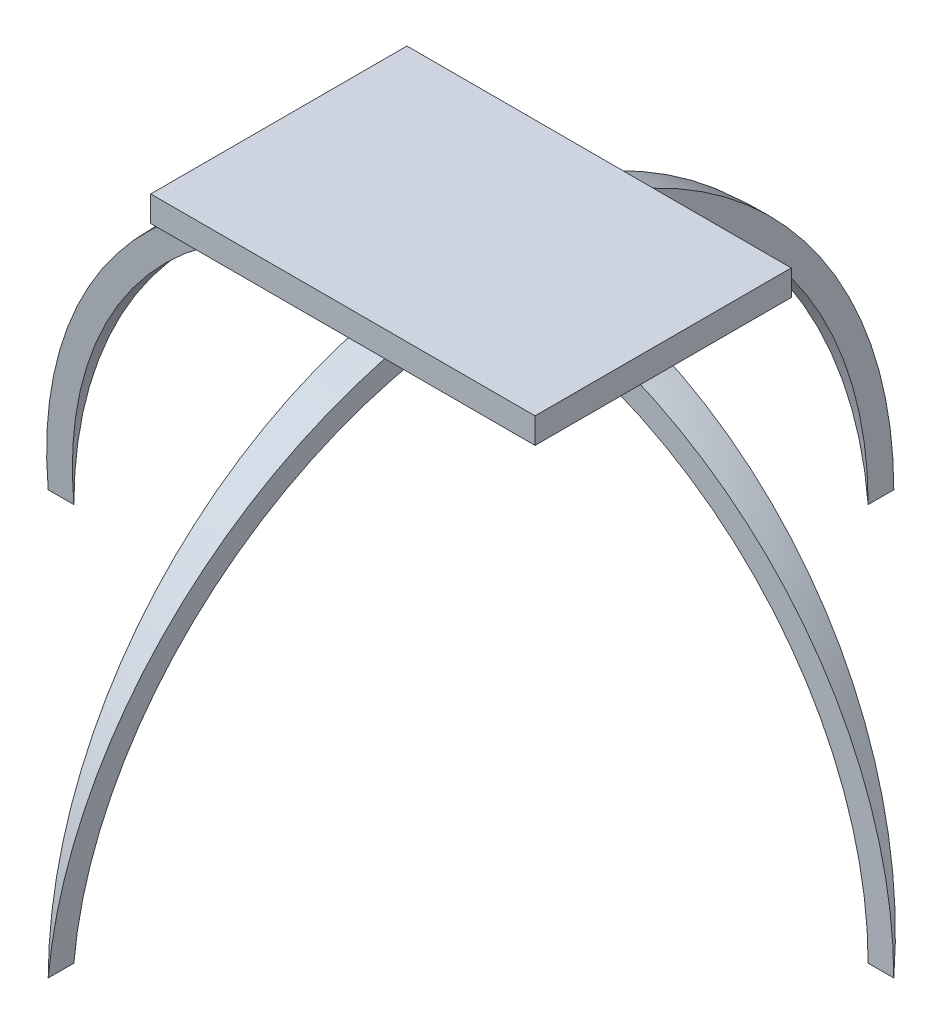
ISO-10303-21;
HEADER;
FILE_DESCRIPTION(('STEP AP214'),'2;1');
FILE_NAME('part.step','',(''),(''),'','','');
FILE_SCHEMA(('AUTOMOTIVE_DESIGN { 1 0 10303 214 1 1 1 1 }'));
ENDSEC;
DATA;
#1=APPLICATION_CONTEXT('core data for automotive mechanical design processes');
#2=APPLICATION_PROTOCOL_DEFINITION('international standard','automotive_design',2000,#1);
#3=PRODUCT_CONTEXT('',#1,'mechanical');
#4=PRODUCT('Part','Part','',(#3));
#5=PRODUCT_RELATED_PRODUCT_CATEGORY('part','',(#4));
#6=PRODUCT_DEFINITION_FORMATION('','',#4);
#7=PRODUCT_DEFINITION_CONTEXT('part definition',#1,'design');
#8=PRODUCT_DEFINITION('design','',#6,#7);
#9=PRODUCT_DEFINITION_SHAPE('','',#8);
#10=(LENGTH_UNIT() NAMED_UNIT(*) SI_UNIT(.MILLI.,.METRE.));
#11=(NAMED_UNIT(*) PLANE_ANGLE_UNIT() SI_UNIT($,.RADIAN.));
#12=(NAMED_UNIT(*) SI_UNIT($,.STERADIAN.) SOLID_ANGLE_UNIT());
#13=UNCERTAINTY_MEASURE_WITH_UNIT(LENGTH_MEASURE(1.E-05),#10,'distance_accuracy_value','');
#14=(GEOMETRIC_REPRESENTATION_CONTEXT(3) GLOBAL_UNCERTAINTY_ASSIGNED_CONTEXT((#13)) GLOBAL_UNIT_ASSIGNED_CONTEXT((#10,
#11,#12)) REPRESENTATION_CONTEXT('',''));
#15=CARTESIAN_POINT('',(0.,0.,0.));
#16=DIRECTION('',(0.,0.,1.));
#17=DIRECTION('',(1.,0.,0.));
#18=AXIS2_PLACEMENT_3D('',#15,#16,#17);
#19=CARTESIAN_POINT('',(0.,164.372125185138,14.3806975533637));
#20=DIRECTION('',(-1.,0.,0.));
#21=DIRECTION('',(0.,-1.,0.));
#22=AXIS2_PLACEMENT_3D('',#19,#20,#21);
#23=PLANE('',#22);
#24=DIRECTION('',(0.,0.,-1.));
#25=VECTOR('',#24,1.);
#26=CARTESIAN_POINT('',(0.,160.,14.3806975533637));
#27=LINE('',#26,#25);
#28=CARTESIAN_POINT('',(0.,160.,-13.9981861641479));
#29=VERTEX_POINT('',#28);
#30=CARTESIAN_POINT('',(1.40746112385639E-13,160.,-40.3112887414928));
#31=VERTEX_POINT('',#30);
#32=EDGE_CURVE('E237',#29,#31,#27,.T.);
#33=ORIENTED_EDGE('',*,*,#32,.F.);
#34=DIRECTION('',(0.,0.996194698091746,-0.0871557427476584));
#35=VECTOR('',#34,1.);
#36=CARTESIAN_POINT('',(0.,164.372125185138,-14.3806975533637));
#37=LINE('',#36,#35);
#38=CARTESIAN_POINT('',(0.,154.410178204221,-13.5091401258871));
#39=VERTEX_POINT('',#38);
#40=EDGE_CURVE('E60',#39,#29,#37,.T.);
#41=ORIENTED_EDGE('',*,*,#40,.F.);
#42=CARTESIAN_POINT('',(-3.05311331771918E-13,-3.13203418881935E-13,0.));
#43=DIRECTION('',(-1.,0.,0.));
#44=DIRECTION('',(0.,-1.,0.));
#45=AXIS2_PLACEMENT_3D('',#42,#43,#44);
#46=CIRCLE('',#45,155.);
#47=CARTESIAN_POINT('',(5.41179607520686E-13,0.,-155.));
#48=VERTEX_POINT('',#47);
#49=EDGE_CURVE('E258',#39,#48,#46,.T.);
#50=ORIENTED_EDGE('',*,*,#49,.T.);
#51=DIRECTION('',(0.,0.,1.));
#52=VECTOR('',#51,1.);
#53=CARTESIAN_POINT('',(5.76094420909117E-13,0.,-165.));
#54=LINE('',#53,#52);
#55=CARTESIAN_POINT('',(5.76094420909117E-13,0.,-165.));
#56=VERTEX_POINT('',#55);
#57=EDGE_CURVE('E201',#56,#48,#54,.T.);
#58=ORIENTED_EDGE('',*,*,#57,.F.);
#59=CARTESIAN_POINT('',(0.,0.,0.));
#60=DIRECTION('',(-1.,0.,0.));
#61=DIRECTION('',(0.,0.,1.));
#62=AXIS2_PLACEMENT_3D('',#59,#60,#61);
#63=CIRCLE('',#62,165.);
#64=EDGE_CURVE('E190',#31,#56,#63,.T.);
#65=ORIENTED_EDGE('',*,*,#64,.F.);
#66=EDGE_LOOP('',(#33,#41,#50,#58,#65));
#67=FACE_BOUND('',#66,.T.);
#68=ADVANCED_FACE('F38',(#67),#23,.F.);
#69=CARTESIAN_POINT('',(0.,0.,0.));
#70=DIRECTION('',(-1.,0.,0.));
#71=DIRECTION('',(0.,0.996194698091746,0.0871557427476584));
#72=AXIS2_PLACEMENT_3D('',#69,#70,#71);
#73=SPHERICAL_SURFACE('',#72,165.);
#74=CARTESIAN_POINT('',(0.,160.,0.));
#75=DIRECTION('',(0.,1.,0.));
#76=DIRECTION('',(0.,0.,1.));
#77=AXIS2_PLACEMENT_3D('',#74,#75,#76);
#78=CIRCLE('',#77,40.3112887414928);
#79=CARTESIAN_POINT('',(-40.3112887414928,160.,0.));
#80=VERTEX_POINT('',#79);
#81=CARTESIAN_POINT('',(-37.8027880468341,160.,13.9981861641479));
#82=VERTEX_POINT('',#81);
#83=EDGE_CURVE('E234',#80,#82,#78,.T.);
#84=ORIENTED_EDGE('',*,*,#83,.F.);
#85=CARTESIAN_POINT('',(0.,0.,0.));
#86=DIRECTION('',(0.,0.,1.));
#87=DIRECTION('',(1.,0.,0.));
#88=AXIS2_PLACEMENT_3D('',#85,#86,#87);
#89=CIRCLE('',#88,165.);
#90=CARTESIAN_POINT('',(-165.,0.,0.));
#91=VERTEX_POINT('',#90);
#92=EDGE_CURVE('E244',#80,#91,#89,.T.);
#93=ORIENTED_EDGE('',*,*,#92,.T.);
#94=CARTESIAN_POINT('',(0.,0.,0.));
#95=DIRECTION('',(0.,-0.0871557427476584,0.996194698091746));
#96=DIRECTION('',(1.,0.,0.));
#97=AXIS2_PLACEMENT_3D('',#94,#95,#96);
#98=CIRCLE('',#97,165.);
#99=EDGE_CURVE('E253',#82,#91,#98,.T.);
#100=ORIENTED_EDGE('',*,*,#99,.F.);
#101=EDGE_LOOP('',(#84,#93,#100));
#102=FACE_BOUND('',#101,.T.);
#103=ADVANCED_FACE('F300',(#102),#73,.T.);
#104=CARTESIAN_POINT('',(0.,0.,0.));
#105=DIRECTION('',(0.,-0.0871557427476584,0.996194698091746));
#106=DIRECTION('',(1.,0.,0.));
#107=AXIS2_PLACEMENT_3D('',#104,#105,#106);
#108=PLANE('',#107);
#109=DIRECTION('',(0.,0.996194698091746,0.0871557427476584));
#110=VECTOR('',#109,1.);
#111=CARTESIAN_POINT('',(0.,164.372125185138,14.3806975533637));
#112=LINE('',#111,#110);
#113=CARTESIAN_POINT('',(-1.41500731960055E-13,154.410178204221,13.5091401258871));
#114=VERTEX_POINT('',#113);
#115=CARTESIAN_POINT('',(-1.46623217309324E-13,160.,13.9981861641479));
#116=VERTEX_POINT('',#115);
#117=EDGE_CURVE('E250',#114,#116,#112,.T.);
#118=ORIENTED_EDGE('',*,*,#117,.T.);
#119=DIRECTION('',(-1.,0.,0.));
#120=VECTOR('',#119,1.);
#121=CARTESIAN_POINT('',(0.,160.,13.9981861641479));
#122=LINE('',#121,#120);
#123=EDGE_CURVE('E239',#116,#82,#122,.T.);
#124=ORIENTED_EDGE('',*,*,#123,.T.);
#125=ORIENTED_EDGE('',*,*,#99,.T.);
#126=DIRECTION('',(1.,0.,0.));
#127=VECTOR('',#126,1.);
#128=CARTESIAN_POINT('',(-165.,0.,0.));
#129=LINE('',#128,#127);
#130=CARTESIAN_POINT('',(-155.,0.,0.));
#131=VERTEX_POINT('',#130);
#132=EDGE_CURVE('E255',#91,#131,#129,.T.);
#133=ORIENTED_EDGE('',*,*,#132,.T.);
#134=CARTESIAN_POINT('',(0.,0.,0.));
#135=DIRECTION('',(0.,0.0871557427476584,-0.996194698091746));
#136=DIRECTION('',(1.,0.,0.));
#137=AXIS2_PLACEMENT_3D('',#134,#135,#136);
#138=CIRCLE('',#137,155.);
#139=EDGE_CURVE('E247',#131,#114,#138,.T.);
#140=ORIENTED_EDGE('',*,*,#139,.T.);
#141=EDGE_LOOP('',(#118,#124,#125,#133,#140));
#142=FACE_BOUND('',#141,.T.);
#143=ADVANCED_FACE('F303',(#142),#108,.T.);
#144=CARTESIAN_POINT('',(0.,0.,0.));
#145=DIRECTION('',(0.,0.,1.));
#146=DIRECTION('',(1.,0.,0.));
#147=AXIS2_PLACEMENT_3D('',#144,#145,#146);
#148=PLANE('',#147);
#149=DIRECTION('',(-1.,0.,0.));
#150=VECTOR('',#149,1.);
#151=CARTESIAN_POINT('',(0.,160.,0.));
#152=LINE('',#151,#150);
#153=CARTESIAN_POINT('',(-13.9981861641478,160.,0.));
#154=VERTEX_POINT('',#153);
#155=EDGE_CURVE('E260',#154,#80,#152,.T.);
#156=ORIENTED_EDGE('',*,*,#155,.F.);
#157=DIRECTION('',(-0.0871557427476584,0.996194698091746,0.));
#158=VECTOR('',#157,1.);
#159=CARTESIAN_POINT('',(-14.3806975533637,164.372125185138,0.));
#160=LINE('',#159,#158);
#161=CARTESIAN_POINT('',(-13.5091401258871,154.410178204221,0.));
#162=VERTEX_POINT('',#161);
#163=EDGE_CURVE('E196',#162,#154,#160,.T.);
#164=ORIENTED_EDGE('',*,*,#163,.F.);
#165=CARTESIAN_POINT('',(0.,0.,0.));
#166=DIRECTION('',(0.,0.,-1.));
#167=DIRECTION('',(1.,0.,0.));
#168=AXIS2_PLACEMENT_3D('',#165,#166,#167);
#169=CIRCLE('',#168,155.);
#170=EDGE_CURVE('E241',#131,#162,#169,.T.);
#171=ORIENTED_EDGE('',*,*,#170,.F.);
#172=ORIENTED_EDGE('',*,*,#132,.F.);
#173=ORIENTED_EDGE('',*,*,#92,.F.);
#174=EDGE_LOOP('',(#156,#164,#171,#172,#173));
#175=FACE_BOUND('',#174,.T.);
#176=ADVANCED_FACE('F295',(#175),#148,.F.);
#177=CARTESIAN_POINT('',(0.,0.,0.));
#178=DIRECTION('',(-1.,0.,0.));
#179=DIRECTION('',(0.,-0.996194698091746,-0.0871557427476584));
#180=AXIS2_PLACEMENT_3D('',#177,#178,#179);
#181=SPHERICAL_SURFACE('',#180,155.);
#182=CARTESIAN_POINT('',(0.,0.,0.));
#183=DIRECTION('',(-1.,0.,0.));
#184=DIRECTION('',(0.,0.,-1.));
#185=AXIS2_PLACEMENT_3D('',#182,#183,#184);
#186=CIRCLE('',#185,155.);
#187=CARTESIAN_POINT('',(-1.62353882256206E-12,0.,155.));
#188=VERTEX_POINT('',#187);
#189=EDGE_CURVE('E165',#188,#114,#186,.T.);
#190=ORIENTED_EDGE('',*,*,#189,.T.);
#191=ORIENTED_EDGE('',*,*,#139,.F.);
#192=ORIENTED_EDGE('',*,*,#170,.T.);
#193=CARTESIAN_POINT('',(0.,0.,0.));
#194=DIRECTION('',(0.996194698091746,0.0871557427476584,0.));
#195=DIRECTION('',(0.,0.,1.));
#196=AXIS2_PLACEMENT_3D('',#193,#194,#195);
#197=CIRCLE('',#196,155.);
#198=EDGE_CURVE('E193',#48,#162,#197,.T.);
#199=ORIENTED_EDGE('',*,*,#198,.F.);
#200=ORIENTED_EDGE('',*,*,#49,.F.);
#201=CARTESIAN_POINT('',(0.,0.,0.));
#202=DIRECTION('',(0.,0.0871557427476584,0.996194698091746));
#203=DIRECTION('',(-1.,0.,0.));
#204=AXIS2_PLACEMENT_3D('',#201,#202,#203);
#205=CIRCLE('',#204,155.);
#206=CARTESIAN_POINT('',(155.,0.,0.));
#207=VERTEX_POINT('',#206);
#208=EDGE_CURVE('E181',#207,#39,#205,.T.);
#209=ORIENTED_EDGE('',*,*,#208,.F.);
#210=CARTESIAN_POINT('',(0.,0.,0.));
#211=DIRECTION('',(0.,0.,1.));
#212=DIRECTION('',(-1.,0.,0.));
#213=AXIS2_PLACEMENT_3D('',#210,#211,#212);
#214=CIRCLE('',#213,155.);
#215=CARTESIAN_POINT('',(13.5091401258871,154.410178204221,0.));
#216=VERTEX_POINT('',#215);
#217=EDGE_CURVE('E175',#207,#216,#214,.T.);
#218=ORIENTED_EDGE('',*,*,#217,.T.);
#219=CARTESIAN_POINT('',(0.,0.,0.));
#220=DIRECTION('',(-0.996194698091746,0.0871557427476584,0.));
#221=DIRECTION('',(0.,0.,-1.));
#222=AXIS2_PLACEMENT_3D('',#219,#220,#221);
#223=CIRCLE('',#222,155.);
#224=EDGE_CURVE('E52',#188,#216,#223,.T.);
#225=ORIENTED_EDGE('',*,*,#224,.F.);
#226=EDGE_LOOP('',(#190,#191,#192,#199,#200,#209,#218,#225));
#227=FACE_BOUND('',#226,.T.);
#228=ADVANCED_FACE('F284',(#227),#181,.F.);
#229=CARTESIAN_POINT('',(75.,170.,-50.));
#230=DIRECTION('',(-1.,0.,0.));
#231=DIRECTION('',(0.,0.,1.));
#232=AXIS2_PLACEMENT_3D('',#229,#230,#231);
#233=PLANE('',#232);
#234=DIRECTION('',(0.,0.,-1.));
#235=VECTOR('',#234,1.);
#236=CARTESIAN_POINT('',(75.,160.,-50.));
#237=LINE('',#236,#235);
#238=CARTESIAN_POINT('',(75.,160.,50.));
#239=VERTEX_POINT('',#238);
#240=CARTESIAN_POINT('',(75.,160.,-50.));
#241=VERTEX_POINT('',#240);
#242=EDGE_CURVE('E204',#239,#241,#237,.T.);
#243=ORIENTED_EDGE('',*,*,#242,.T.);
#244=DIRECTION('',(0.,-1.,0.));
#245=VECTOR('',#244,1.);
#246=CARTESIAN_POINT('',(75.,170.,-50.));
#247=LINE('',#246,#245);
#248=CARTESIAN_POINT('',(75.,170.,-50.));
#249=VERTEX_POINT('',#248);
#250=EDGE_CURVE('E231',#249,#241,#247,.T.);
#251=ORIENTED_EDGE('',*,*,#250,.F.);
#252=DIRECTION('',(0.,0.,-1.));
#253=VECTOR('',#252,1.);
#254=CARTESIAN_POINT('',(75.,170.,-50.));
#255=LINE('',#254,#253);
#256=CARTESIAN_POINT('',(75.,170.,50.));
#257=VERTEX_POINT('',#256);
#258=EDGE_CURVE('E205',#257,#249,#255,.T.);
#259=ORIENTED_EDGE('',*,*,#258,.F.);
#260=DIRECTION('',(0.,-1.,0.));
#261=VECTOR('',#260,1.);
#262=CARTESIAN_POINT('',(75.,170.,50.));
#263=LINE('',#262,#261);
#264=EDGE_CURVE('E215',#257,#239,#263,.T.);
#265=ORIENTED_EDGE('',*,*,#264,.T.);
#266=EDGE_LOOP('',(#243,#251,#259,#265));
#267=FACE_BOUND('',#266,.T.);
#268=ADVANCED_FACE('F330',(#267),#233,.F.);
#269=CARTESIAN_POINT('',(-75.,170.,-50.));
#270=DIRECTION('',(0.,0.,1.));
#271=DIRECTION('',(1.,0.,0.));
#272=AXIS2_PLACEMENT_3D('',#269,#270,#271);
#273=PLANE('',#272);
#274=DIRECTION('',(-1.,0.,0.));
#275=VECTOR('',#274,1.);
#276=CARTESIAN_POINT('',(-75.,160.,-50.));
#277=LINE('',#276,#275);
#278=CARTESIAN_POINT('',(-75.,160.,-50.));
#279=VERTEX_POINT('',#278);
#280=EDGE_CURVE('E218',#241,#279,#277,.T.);
#281=ORIENTED_EDGE('',*,*,#280,.T.);
#282=DIRECTION('',(0.,-1.,0.));
#283=VECTOR('',#282,1.);
#284=CARTESIAN_POINT('',(-75.,170.,-50.));
#285=LINE('',#284,#283);
#286=CARTESIAN_POINT('',(-75.,170.,-50.));
#287=VERTEX_POINT('',#286);
#288=EDGE_CURVE('E228',#287,#279,#285,.T.);
#289=ORIENTED_EDGE('',*,*,#288,.F.);
#290=DIRECTION('',(-1.,0.,0.));
#291=VECTOR('',#290,1.);
#292=CARTESIAN_POINT('',(-75.,170.,-50.));
#293=LINE('',#292,#291);
#294=EDGE_CURVE('E208',#249,#287,#293,.T.);
#295=ORIENTED_EDGE('',*,*,#294,.F.);
#296=ORIENTED_EDGE('',*,*,#250,.T.);
#297=EDGE_LOOP('',(#281,#289,#295,#296));
#298=FACE_BOUND('',#297,.T.);
#299=ADVANCED_FACE('F336',(#298),#273,.F.);
#300=CARTESIAN_POINT('',(-75.,170.,-50.));
#301=DIRECTION('',(1.,0.,0.));
#302=DIRECTION('',(0.,0.,-1.));
#303=AXIS2_PLACEMENT_3D('',#300,#301,#302);
#304=PLANE('',#303);
#305=DIRECTION('',(0.,0.,1.));
#306=VECTOR('',#305,1.);
#307=CARTESIAN_POINT('',(-75.,160.,-50.));
#308=LINE('',#307,#306);
#309=CARTESIAN_POINT('',(-75.,160.,50.));
#310=VERTEX_POINT('',#309);
#311=EDGE_CURVE('E220',#279,#310,#308,.T.);
#312=ORIENTED_EDGE('',*,*,#311,.T.);
#313=DIRECTION('',(0.,-1.,0.));
#314=VECTOR('',#313,1.);
#315=CARTESIAN_POINT('',(-75.,170.,50.));
#316=LINE('',#315,#314);
#317=CARTESIAN_POINT('',(-75.,170.,50.));
#318=VERTEX_POINT('',#317);
#319=EDGE_CURVE('E225',#318,#310,#316,.T.);
#320=ORIENTED_EDGE('',*,*,#319,.F.);
#321=DIRECTION('',(0.,0.,1.));
#322=VECTOR('',#321,1.);
#323=CARTESIAN_POINT('',(-75.,170.,-50.));
#324=LINE('',#323,#322);
#325=EDGE_CURVE('E211',#287,#318,#324,.T.);
#326=ORIENTED_EDGE('',*,*,#325,.F.);
#327=ORIENTED_EDGE('',*,*,#288,.T.);
#328=EDGE_LOOP('',(#312,#320,#326,#327));
#329=FACE_BOUND('',#328,.T.);
#330=ADVANCED_FACE('F340',(#329),#304,.F.);
#331=CARTESIAN_POINT('',(-75.,170.,50.));
#332=DIRECTION('',(0.,0.,-1.));
#333=DIRECTION('',(-1.,0.,0.));
#334=AXIS2_PLACEMENT_3D('',#331,#332,#333);
#335=PLANE('',#334);
#336=DIRECTION('',(1.,0.,0.));
#337=VECTOR('',#336,1.);
#338=CARTESIAN_POINT('',(-75.,160.,50.));
#339=LINE('',#338,#337);
#340=EDGE_CURVE('E209',#310,#239,#339,.T.);
#341=ORIENTED_EDGE('',*,*,#340,.T.);
#342=ORIENTED_EDGE('',*,*,#264,.F.);
#343=DIRECTION('',(1.,0.,0.));
#344=VECTOR('',#343,1.);
#345=CARTESIAN_POINT('',(-75.,170.,50.));
#346=LINE('',#345,#344);
#347=EDGE_CURVE('E213',#318,#257,#346,.T.);
#348=ORIENTED_EDGE('',*,*,#347,.F.);
#349=ORIENTED_EDGE('',*,*,#319,.T.);
#350=EDGE_LOOP('',(#341,#342,#348,#349));
#351=FACE_BOUND('',#350,.T.);
#352=ADVANCED_FACE('F344',(#351),#335,.F.);
#353=CARTESIAN_POINT('',(0.,170.,0.));
#354=DIRECTION('',(0.,1.,0.));
#355=DIRECTION('',(0.,0.,1.));
#356=AXIS2_PLACEMENT_3D('',#353,#354,#355);
#357=PLANE('',#356);
#358=ORIENTED_EDGE('',*,*,#258,.T.);
#359=ORIENTED_EDGE('',*,*,#294,.T.);
#360=ORIENTED_EDGE('',*,*,#325,.T.);
#361=ORIENTED_EDGE('',*,*,#347,.T.);
#362=EDGE_LOOP('',(#358,#359,#360,#361));
#363=FACE_BOUND('',#362,.T.);
#364=ADVANCED_FACE('F348',(#363),#357,.T.);
#365=CARTESIAN_POINT('',(0.,160.,0.));
#366=DIRECTION('',(0.,1.,0.));
#367=DIRECTION('',(0.,0.,1.));
#368=AXIS2_PLACEMENT_3D('',#365,#366,#367);
#369=PLANE('',#368);
#370=CARTESIAN_POINT('',(0.,160.,0.));
#371=DIRECTION('',(0.,1.,0.));
#372=DIRECTION('',(0.,0.,1.));
#373=AXIS2_PLACEMENT_3D('',#370,#371,#372);
#374=CIRCLE('',#373,40.3112887414928);
#375=CARTESIAN_POINT('',(13.9981861641475,160.,37.8027880468342));
#376=VERTEX_POINT('',#375);
#377=CARTESIAN_POINT('',(-4.22238337156918E-13,160.,40.3112887414928));
#378=VERTEX_POINT('',#377);
#379=EDGE_CURVE('E11',#376,#378,#374,.F.);
#380=ORIENTED_EDGE('',*,*,#379,.F.);
#381=DIRECTION('',(0.,0.,-1.));
#382=VECTOR('',#381,1.);
#383=CARTESIAN_POINT('',(13.9981861641479,160.,1.49097893290887E-13));
#384=LINE('',#383,#382);
#385=CARTESIAN_POINT('',(13.9981861641479,160.,1.42189038903176E-13));
#386=VERTEX_POINT('',#385);
#387=EDGE_CURVE('E155',#376,#386,#384,.T.);
#388=ORIENTED_EDGE('',*,*,#387,.T.);
#389=DIRECTION('',(-1.,0.,0.));
#390=VECTOR('',#389,1.);
#391=CARTESIAN_POINT('',(0.,160.,0.));
#392=LINE('',#391,#390);
#393=CARTESIAN_POINT('',(40.3112887414928,160.,0.));
#394=VERTEX_POINT('',#393);
#395=EDGE_CURVE('E267',#394,#386,#392,.T.);
#396=ORIENTED_EDGE('',*,*,#395,.F.);
#397=CARTESIAN_POINT('',(0.,160.,0.));
#398=DIRECTION('',(0.,1.,0.));
#399=DIRECTION('',(0.,0.,1.));
#400=AXIS2_PLACEMENT_3D('',#397,#398,#399);
#401=CIRCLE('',#400,40.3112887414928);
#402=CARTESIAN_POINT('',(37.8027880468341,160.,-13.9981861641479));
#403=VERTEX_POINT('',#402);
#404=EDGE_CURVE('E270',#403,#394,#401,.F.);
#405=ORIENTED_EDGE('',*,*,#404,.F.);
#406=DIRECTION('',(-1.,0.,0.));
#407=VECTOR('',#406,1.);
#408=CARTESIAN_POINT('',(0.,160.,-13.9981861641479));
#409=LINE('',#408,#407);
#410=EDGE_CURVE('E45',#403,#29,#409,.T.);
#411=ORIENTED_EDGE('',*,*,#410,.T.);
#412=ORIENTED_EDGE('',*,*,#32,.T.);
#413=CARTESIAN_POINT('',(0.,160.,0.));
#414=DIRECTION('',(0.,1.,0.));
#415=DIRECTION('',(0.,0.,1.));
#416=AXIS2_PLACEMENT_3D('',#413,#414,#415);
#417=CIRCLE('',#416,40.3112887414928);
#418=CARTESIAN_POINT('',(-13.9981861641478,160.,-37.8027880468341));
#419=VERTEX_POINT('',#418);
#420=EDGE_CURVE('E262',#419,#31,#417,.F.);
#421=ORIENTED_EDGE('',*,*,#420,.F.);
#422=DIRECTION('',(0.,0.,1.));
#423=VECTOR('',#422,1.);
#424=CARTESIAN_POINT('',(-13.9981861641479,160.,0.));
#425=LINE('',#424,#423);
#426=EDGE_CURVE('E265',#419,#154,#425,.T.);
#427=ORIENTED_EDGE('',*,*,#426,.T.);
#428=ORIENTED_EDGE('',*,*,#155,.T.);
#429=ORIENTED_EDGE('',*,*,#83,.T.);
#430=ORIENTED_EDGE('',*,*,#123,.F.);
#431=DIRECTION('',(0.,0.,-1.));
#432=VECTOR('',#431,1.);
#433=CARTESIAN_POINT('',(0.,160.,0.));
#434=LINE('',#433,#432);
#435=EDGE_CURVE('E169',#378,#116,#434,.T.);
#436=ORIENTED_EDGE('',*,*,#435,.F.);
#437=EDGE_LOOP('',(#380,#388,#396,#405,#411,#412,#421,#427,#428,#429,#430,#436));
#438=FACE_BOUND('',#437,.T.);
#439=ORIENTED_EDGE('',*,*,#242,.F.);
#440=ORIENTED_EDGE('',*,*,#340,.F.);
#441=ORIENTED_EDGE('',*,*,#311,.F.);
#442=ORIENTED_EDGE('',*,*,#280,.F.);
#443=EDGE_LOOP('',(#439,#440,#441,#442));
#444=FACE_BOUND('',#443,.T.);
#445=ADVANCED_FACE('F274',(#438,#444),#369,.F.);
#446=CARTESIAN_POINT('',(0.,0.,0.));
#447=DIRECTION('',(0.,0.,-1.));
#448=DIRECTION('',(-0.0871557427476584,0.996194698091746,0.));
#449=AXIS2_PLACEMENT_3D('',#446,#447,#448);
#450=SPHERICAL_SURFACE('',#449,165.);
#451=CARTESIAN_POINT('',(0.,0.,0.));
#452=DIRECTION('',(-0.996194698091746,-0.0871557427476584,0.));
#453=DIRECTION('',(0.,0.,1.));
#454=AXIS2_PLACEMENT_3D('',#451,#452,#453);
#455=CIRCLE('',#454,165.);
#456=EDGE_CURVE('E199',#419,#56,#455,.T.);
#457=ORIENTED_EDGE('',*,*,#456,.F.);
#458=ORIENTED_EDGE('',*,*,#420,.T.);
#459=ORIENTED_EDGE('',*,*,#64,.T.);
#460=EDGE_LOOP('',(#457,#458,#459));
#461=FACE_BOUND('',#460,.T.);
#462=ADVANCED_FACE('F291',(#461),#450,.T.);
#463=CARTESIAN_POINT('',(0.,0.,0.));
#464=DIRECTION('',(-0.996194698091746,-0.0871557427476584,0.));
#465=DIRECTION('',(0.,0.,1.));
#466=AXIS2_PLACEMENT_3D('',#463,#464,#465);
#467=PLANE('',#466);
#468=ORIENTED_EDGE('',*,*,#426,.F.);
#469=ORIENTED_EDGE('',*,*,#456,.T.);
#470=ORIENTED_EDGE('',*,*,#57,.T.);
#471=ORIENTED_EDGE('',*,*,#198,.T.);
#472=ORIENTED_EDGE('',*,*,#163,.T.);
#473=EDGE_LOOP('',(#468,#469,#470,#471,#472));
#474=FACE_BOUND('',#473,.T.);
#475=ADVANCED_FACE('F288',(#474),#467,.T.);
#476=CARTESIAN_POINT('',(0.,0.,0.));
#477=DIRECTION('',(1.,0.,0.));
#478=DIRECTION('',(0.,0.996194698091746,-0.0871557427476584));
#479=AXIS2_PLACEMENT_3D('',#476,#477,#478);
#480=SPHERICAL_SURFACE('',#479,165.);
#481=CARTESIAN_POINT('',(0.,0.,0.));
#482=DIRECTION('',(0.,-0.0871557427476584,-0.996194698091746));
#483=DIRECTION('',(-1.,0.,0.));
#484=AXIS2_PLACEMENT_3D('',#481,#482,#483);
#485=CIRCLE('',#484,165.);
#486=CARTESIAN_POINT('',(165.,0.,0.));
#487=VERTEX_POINT('',#486);
#488=EDGE_CURVE('E185',#403,#487,#485,.T.);
#489=ORIENTED_EDGE('',*,*,#488,.F.);
#490=ORIENTED_EDGE('',*,*,#404,.T.);
#491=CARTESIAN_POINT('',(0.,0.,0.));
#492=DIRECTION('',(0.,0.,-1.));
#493=DIRECTION('',(-1.,0.,0.));
#494=AXIS2_PLACEMENT_3D('',#491,#492,#493);
#495=CIRCLE('',#494,165.);
#496=EDGE_CURVE('E178',#394,#487,#495,.T.);
#497=ORIENTED_EDGE('',*,*,#496,.T.);
#498=EDGE_LOOP('',(#489,#490,#497));
#499=FACE_BOUND('',#498,.T.);
#500=ADVANCED_FACE('F311',(#499),#480,.T.);
#501=CARTESIAN_POINT('',(0.,0.,0.));
#502=DIRECTION('',(0.,-0.0871557427476584,-0.996194698091746));
#503=DIRECTION('',(-1.,0.,0.));
#504=AXIS2_PLACEMENT_3D('',#501,#502,#503);
#505=PLANE('',#504);
#506=ORIENTED_EDGE('',*,*,#410,.F.);
#507=ORIENTED_EDGE('',*,*,#488,.T.);
#508=DIRECTION('',(-1.,0.,0.));
#509=VECTOR('',#508,1.);
#510=CARTESIAN_POINT('',(165.,0.,0.));
#511=LINE('',#510,#509);
#512=EDGE_CURVE('E187',#487,#207,#511,.T.);
#513=ORIENTED_EDGE('',*,*,#512,.T.);
#514=ORIENTED_EDGE('',*,*,#208,.T.);
#515=ORIENTED_EDGE('',*,*,#40,.T.);
#516=EDGE_LOOP('',(#506,#507,#513,#514,#515));
#517=FACE_BOUND('',#516,.T.);
#518=ADVANCED_FACE('F280',(#517),#505,.T.);
#519=CARTESIAN_POINT('',(0.,0.,0.));
#520=DIRECTION('',(0.,0.,-1.));
#521=DIRECTION('',(-1.,0.,0.));
#522=AXIS2_PLACEMENT_3D('',#519,#520,#521);
#523=PLANE('',#522);
#524=ORIENTED_EDGE('',*,*,#395,.T.);
#525=DIRECTION('',(0.0871557427476584,0.996194698091746,0.));
#526=VECTOR('',#525,1.);
#527=CARTESIAN_POINT('',(14.3806975533637,164.372125185138,1.41795201404155E-13));
#528=LINE('',#527,#526);
#529=EDGE_CURVE('E158',#216,#386,#528,.T.);
#530=ORIENTED_EDGE('',*,*,#529,.F.);
#531=ORIENTED_EDGE('',*,*,#217,.F.);
#532=ORIENTED_EDGE('',*,*,#512,.F.);
#533=ORIENTED_EDGE('',*,*,#496,.F.);
#534=EDGE_LOOP('',(#524,#530,#531,#532,#533));
#535=FACE_BOUND('',#534,.T.);
#536=ADVANCED_FACE('F309',(#535),#523,.F.);
#537=CARTESIAN_POINT('',(0.,0.,0.));
#538=DIRECTION('',(0.,0.,1.));
#539=DIRECTION('',(0.0871557427476584,0.996194698091746,0.));
#540=AXIS2_PLACEMENT_3D('',#537,#538,#539);
#541=SPHERICAL_SURFACE('',#540,165.);
#542=CARTESIAN_POINT('',(0.,0.,0.));
#543=DIRECTION('',(0.996194698091746,-0.0871557427476584,0.));
#544=DIRECTION('',(0.,0.,-1.));
#545=AXIS2_PLACEMENT_3D('',#542,#543,#544);
#546=CIRCLE('',#545,165.);
#547=CARTESIAN_POINT('',(-1.72828326272735E-12,0.,165.));
#548=VERTEX_POINT('',#547);
#549=EDGE_CURVE('E149',#376,#548,#546,.T.);
#550=ORIENTED_EDGE('',*,*,#549,.F.);
#551=ORIENTED_EDGE('',*,*,#379,.T.);
#552=CARTESIAN_POINT('',(0.,0.,0.));
#553=DIRECTION('',(1.,0.,0.));
#554=DIRECTION('',(0.,0.,-1.));
#555=AXIS2_PLACEMENT_3D('',#552,#553,#554);
#556=CIRCLE('',#555,165.);
#557=EDGE_CURVE('E161',#378,#548,#556,.T.);
#558=ORIENTED_EDGE('',*,*,#557,.T.);
#559=EDGE_LOOP('',(#550,#551,#558));
#560=FACE_BOUND('',#559,.T.);
#561=ADVANCED_FACE('F162',(#560),#541,.T.);
#562=CARTESIAN_POINT('',(0.,0.,0.));
#563=DIRECTION('',(0.996194698091746,-0.0871557427476584,0.));
#564=DIRECTION('',(0.,0.,-1.));
#565=AXIS2_PLACEMENT_3D('',#562,#563,#564);
#566=PLANE('',#565);
#567=ORIENTED_EDGE('',*,*,#387,.F.);
#568=ORIENTED_EDGE('',*,*,#549,.T.);
#569=DIRECTION('',(0.,0.,-1.));
#570=VECTOR('',#569,1.);
#571=CARTESIAN_POINT('',(-1.72828326272735E-12,0.,165.));
#572=LINE('',#571,#570);
#573=EDGE_CURVE('E153',#548,#188,#572,.T.);
#574=ORIENTED_EDGE('',*,*,#573,.T.);
#575=ORIENTED_EDGE('',*,*,#224,.T.);
#576=ORIENTED_EDGE('',*,*,#529,.T.);
#577=EDGE_LOOP('',(#567,#568,#574,#575,#576));
#578=FACE_BOUND('',#577,.T.);
#579=ADVANCED_FACE('F151',(#578),#566,.T.);
#580=CARTESIAN_POINT('',(0.,0.,0.));
#581=DIRECTION('',(1.,0.,0.));
#582=DIRECTION('',(0.,0.,-1.));
#583=AXIS2_PLACEMENT_3D('',#580,#581,#582);
#584=PLANE('',#583);
#585=ORIENTED_EDGE('',*,*,#117,.F.);
#586=ORIENTED_EDGE('',*,*,#189,.F.);
#587=ORIENTED_EDGE('',*,*,#573,.F.);
#588=ORIENTED_EDGE('',*,*,#557,.F.);
#589=ORIENTED_EDGE('',*,*,#435,.T.);
#590=EDGE_LOOP('',(#585,#586,#587,#588,#589));
#591=FACE_BOUND('',#590,.T.);
#592=ADVANCED_FACE('F167',(#591),#584,.F.);
#593=CLOSED_SHELL('',(#68,#103,#143,#176,#228,#268,#299,#330,#352,#364,#445,#462,#475,#500,#518,
#536,#561,#579,#592));
#594=MANIFOLD_SOLID_BREP('B2',#593);
#595=ADVANCED_BREP_SHAPE_REPRESENTATION('',(#18,#594),#14);
#596=SHAPE_DEFINITION_REPRESENTATION(#9,#595);
ENDSEC;
END-ISO-10303-21;
